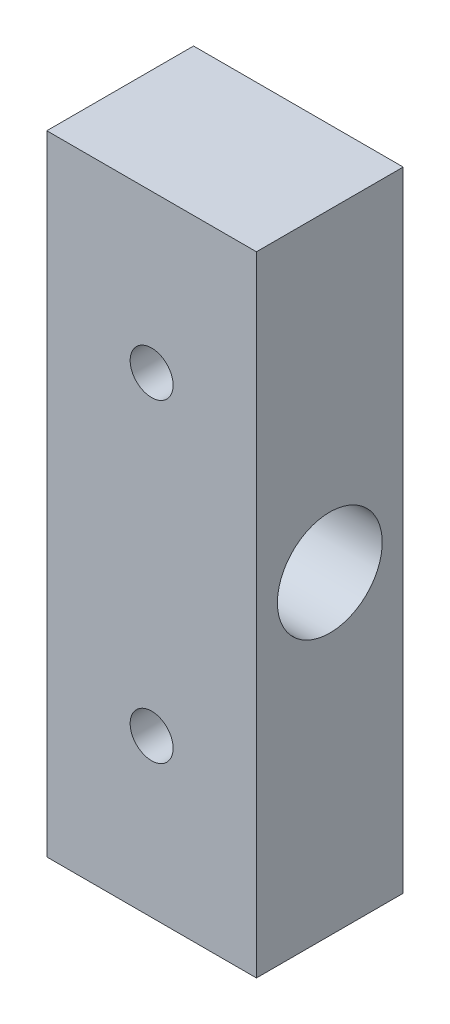
ISO-10303-21;
HEADER;
FILE_DESCRIPTION(('STEP AP214'),'2;1');
FILE_NAME('part.step','',(''),(''),'','','');
FILE_SCHEMA(('AUTOMOTIVE_DESIGN { 1 0 10303 214 1 1 1 1 }'));
ENDSEC;
DATA;
#1=APPLICATION_CONTEXT('core data for automotive mechanical design processes');
#2=APPLICATION_PROTOCOL_DEFINITION('international standard','automotive_design',2000,#1);
#3=PRODUCT_CONTEXT('',#1,'mechanical');
#4=PRODUCT('Part','Part','',(#3));
#5=PRODUCT_RELATED_PRODUCT_CATEGORY('part','',(#4));
#6=PRODUCT_DEFINITION_FORMATION('','',#4);
#7=PRODUCT_DEFINITION_CONTEXT('part definition',#1,'design');
#8=PRODUCT_DEFINITION('design','',#6,#7);
#9=PRODUCT_DEFINITION_SHAPE('','',#8);
#10=(LENGTH_UNIT() NAMED_UNIT(*) SI_UNIT(.MILLI.,.METRE.));
#11=(NAMED_UNIT(*) PLANE_ANGLE_UNIT() SI_UNIT($,.RADIAN.));
#12=(NAMED_UNIT(*) SI_UNIT($,.STERADIAN.) SOLID_ANGLE_UNIT());
#13=UNCERTAINTY_MEASURE_WITH_UNIT(LENGTH_MEASURE(1.E-05),#10,'distance_accuracy_value','');
#14=(GEOMETRIC_REPRESENTATION_CONTEXT(3) GLOBAL_UNCERTAINTY_ASSIGNED_CONTEXT((#13)) GLOBAL_UNIT_ASSIGNED_CONTEXT((#10,
#11,#12)) REPRESENTATION_CONTEXT('',''));
#15=CARTESIAN_POINT('',(0.,0.,0.));
#16=DIRECTION('',(0.,0.,1.));
#17=DIRECTION('',(1.,0.,0.));
#18=AXIS2_PLACEMENT_3D('',#15,#16,#17);
#19=CARTESIAN_POINT('',(10.,60.,-7.));
#20=DIRECTION('',(-1.,0.,0.));
#21=DIRECTION('',(0.,0.,1.));
#22=AXIS2_PLACEMENT_3D('',#19,#20,#21);
#23=PLANE('',#22);
#24=CARTESIAN_POINT('',(10.,30.,0.));
#25=DIRECTION('',(-1.,0.,0.));
#26=DIRECTION('',(0.,0.,1.));
#27=AXIS2_PLACEMENT_3D('',#24,#25,#26);
#28=CIRCLE('',#27,5.);
#29=CARTESIAN_POINT('',(10.,30.,5.));
#30=VERTEX_POINT('',#29);
#31=EDGE_CURVE('E105',#30,#30,#28,.F.);
#32=ORIENTED_EDGE('',*,*,#31,.F.);
#33=EDGE_LOOP('',(#32));
#34=FACE_BOUND('',#33,.T.);
#35=DIRECTION('',(0.,0.,-1.));
#36=VECTOR('',#35,1.);
#37=CARTESIAN_POINT('',(10.,0.,-7.));
#38=LINE('',#37,#36);
#39=CARTESIAN_POINT('',(10.,0.,7.));
#40=VERTEX_POINT('',#39);
#41=CARTESIAN_POINT('',(10.,0.,-7.));
#42=VERTEX_POINT('',#41);
#43=EDGE_CURVE('E102',#40,#42,#38,.T.);
#44=ORIENTED_EDGE('',*,*,#43,.T.);
#45=DIRECTION('',(0.,-1.,0.));
#46=VECTOR('',#45,1.);
#47=CARTESIAN_POINT('',(10.,60.,-7.));
#48=LINE('',#47,#46);
#49=CARTESIAN_POINT('',(10.,60.,-7.));
#50=VERTEX_POINT('',#49);
#51=EDGE_CURVE('E11',#50,#42,#48,.T.);
#52=ORIENTED_EDGE('',*,*,#51,.F.);
#53=DIRECTION('',(0.,0.,-1.));
#54=VECTOR('',#53,1.);
#55=CARTESIAN_POINT('',(10.,60.,-7.));
#56=LINE('',#55,#54);
#57=CARTESIAN_POINT('',(10.,60.,7.));
#58=VERTEX_POINT('',#57);
#59=EDGE_CURVE('E90',#58,#50,#56,.T.);
#60=ORIENTED_EDGE('',*,*,#59,.F.);
#61=DIRECTION('',(0.,-1.,0.));
#62=VECTOR('',#61,1.);
#63=CARTESIAN_POINT('',(10.,60.,7.));
#64=LINE('',#63,#62);
#65=EDGE_CURVE('E98',#58,#40,#64,.T.);
#66=ORIENTED_EDGE('',*,*,#65,.T.);
#67=EDGE_LOOP('',(#44,#52,#60,#66));
#68=FACE_BOUND('',#67,.T.);
#69=ADVANCED_FACE('F39',(#34,#68),#23,.F.);
#70=CARTESIAN_POINT('',(-10.,60.,-7.));
#71=DIRECTION('',(0.,0.,1.));
#72=DIRECTION('',(1.,0.,0.));
#73=AXIS2_PLACEMENT_3D('',#70,#71,#72);
#74=PLANE('',#73);
#75=CARTESIAN_POINT('',(0.,45.,-7.));
#76=DIRECTION('',(0.,0.,-1.));
#77=DIRECTION('',(-1.,0.,0.));
#78=AXIS2_PLACEMENT_3D('',#75,#76,#77);
#79=CIRCLE('',#78,2.05);
#80=CARTESIAN_POINT('',(-2.05,45.,-7.));
#81=VERTEX_POINT('',#80);
#82=EDGE_CURVE('E125',#81,#81,#79,.T.);
#83=ORIENTED_EDGE('',*,*,#82,.F.);
#84=EDGE_LOOP('',(#83));
#85=FACE_BOUND('',#84,.T.);
#86=CARTESIAN_POINT('',(0.,15.,-7.));
#87=DIRECTION('',(0.,0.,-1.));
#88=DIRECTION('',(1.,0.,0.));
#89=AXIS2_PLACEMENT_3D('',#86,#87,#88);
#90=CIRCLE('',#89,2.05);
#91=CARTESIAN_POINT('',(-2.05000000000001,15.,-7.));
#92=VERTEX_POINT('',#91);
#93=EDGE_CURVE('E122',#92,#92,#90,.T.);
#94=ORIENTED_EDGE('',*,*,#93,.F.);
#95=EDGE_LOOP('',(#94));
#96=FACE_BOUND('',#95,.T.);
#97=DIRECTION('',(-1.,0.,0.));
#98=VECTOR('',#97,1.);
#99=CARTESIAN_POINT('',(-10.,0.,-7.));
#100=LINE('',#99,#98);
#101=CARTESIAN_POINT('',(-10.,0.,-7.));
#102=VERTEX_POINT('',#101);
#103=EDGE_CURVE('E94',#42,#102,#100,.T.);
#104=ORIENTED_EDGE('',*,*,#103,.T.);
#105=DIRECTION('',(0.,-1.,0.));
#106=VECTOR('',#105,1.);
#107=CARTESIAN_POINT('',(-10.,60.,-7.));
#108=LINE('',#107,#106);
#109=CARTESIAN_POINT('',(-10.,60.,-7.));
#110=VERTEX_POINT('',#109);
#111=EDGE_CURVE('E47',#110,#102,#108,.T.);
#112=ORIENTED_EDGE('',*,*,#111,.F.);
#113=DIRECTION('',(-1.,0.,0.));
#114=VECTOR('',#113,1.);
#115=CARTESIAN_POINT('',(-10.,60.,-7.));
#116=LINE('',#115,#114);
#117=EDGE_CURVE('E85',#50,#110,#116,.T.);
#118=ORIENTED_EDGE('',*,*,#117,.F.);
#119=ORIENTED_EDGE('',*,*,#51,.T.);
#120=EDGE_LOOP('',(#104,#112,#118,#119));
#121=FACE_BOUND('',#120,.T.);
#122=ADVANCED_FACE('F93',(#85,#96,#121),#74,.F.);
#123=CARTESIAN_POINT('',(-10.,60.,-7.));
#124=DIRECTION('',(1.,0.,0.));
#125=DIRECTION('',(0.,0.,-1.));
#126=AXIS2_PLACEMENT_3D('',#123,#124,#125);
#127=PLANE('',#126);
#128=CARTESIAN_POINT('',(-10.,30.,0.));
#129=DIRECTION('',(-1.,0.,0.));
#130=DIRECTION('',(0.,0.,1.));
#131=AXIS2_PLACEMENT_3D('',#128,#129,#130);
#132=CIRCLE('',#131,5.);
#133=CARTESIAN_POINT('',(-10.,30.,5.));
#134=VERTEX_POINT('',#133);
#135=EDGE_CURVE('E118',#134,#134,#132,.T.);
#136=ORIENTED_EDGE('',*,*,#135,.F.);
#137=EDGE_LOOP('',(#136));
#138=FACE_BOUND('',#137,.T.);
#139=DIRECTION('',(0.,0.,1.));
#140=VECTOR('',#139,1.);
#141=CARTESIAN_POINT('',(-10.,0.,-7.));
#142=LINE('',#141,#140);
#143=CARTESIAN_POINT('',(-10.,0.,7.));
#144=VERTEX_POINT('',#143);
#145=EDGE_CURVE('E72',#102,#144,#142,.T.);
#146=ORIENTED_EDGE('',*,*,#145,.T.);
#147=DIRECTION('',(0.,-1.,0.));
#148=VECTOR('',#147,1.);
#149=CARTESIAN_POINT('',(-10.,60.,7.));
#150=LINE('',#149,#148);
#151=CARTESIAN_POINT('',(-10.,60.,7.));
#152=VERTEX_POINT('',#151);
#153=EDGE_CURVE('E95',#152,#144,#150,.T.);
#154=ORIENTED_EDGE('',*,*,#153,.F.);
#155=DIRECTION('',(0.,0.,1.));
#156=VECTOR('',#155,1.);
#157=CARTESIAN_POINT('',(-10.,60.,-7.));
#158=LINE('',#157,#156);
#159=EDGE_CURVE('E88',#110,#152,#158,.T.);
#160=ORIENTED_EDGE('',*,*,#159,.F.);
#161=ORIENTED_EDGE('',*,*,#111,.T.);
#162=EDGE_LOOP('',(#146,#154,#160,#161));
#163=FACE_BOUND('',#162,.T.);
#164=ADVANCED_FACE('F96',(#138,#163),#127,.F.);
#165=CARTESIAN_POINT('',(-10.,60.,7.));
#166=DIRECTION('',(0.,0.,-1.));
#167=DIRECTION('',(-1.,0.,0.));
#168=AXIS2_PLACEMENT_3D('',#165,#166,#167);
#169=PLANE('',#168);
#170=CARTESIAN_POINT('',(0.,45.,7.));
#171=DIRECTION('',(0.,0.,-1.));
#172=DIRECTION('',(-1.,0.,0.));
#173=AXIS2_PLACEMENT_3D('',#170,#171,#172);
#174=CIRCLE('',#173,2.05);
#175=CARTESIAN_POINT('',(-2.05,45.,7.));
#176=VERTEX_POINT('',#175);
#177=EDGE_CURVE('E121',#176,#176,#174,.F.);
#178=ORIENTED_EDGE('',*,*,#177,.F.);
#179=EDGE_LOOP('',(#178));
#180=FACE_BOUND('',#179,.T.);
#181=CARTESIAN_POINT('',(0.,15.,7.));
#182=DIRECTION('',(0.,0.,-1.));
#183=DIRECTION('',(-1.,0.,0.));
#184=AXIS2_PLACEMENT_3D('',#181,#182,#183);
#185=CIRCLE('',#184,2.05);
#186=CARTESIAN_POINT('',(-2.05000000000001,15.,7.));
#187=VERTEX_POINT('',#186);
#188=EDGE_CURVE('E126',#187,#187,#185,.F.);
#189=ORIENTED_EDGE('',*,*,#188,.F.);
#190=EDGE_LOOP('',(#189));
#191=FACE_BOUND('',#190,.T.);
#192=DIRECTION('',(1.,0.,0.));
#193=VECTOR('',#192,1.);
#194=CARTESIAN_POINT('',(-10.,0.,7.));
#195=LINE('',#194,#193);
#196=EDGE_CURVE('E78',#144,#40,#195,.T.);
#197=ORIENTED_EDGE('',*,*,#196,.T.);
#198=ORIENTED_EDGE('',*,*,#65,.F.);
#199=DIRECTION('',(1.,0.,0.));
#200=VECTOR('',#199,1.);
#201=CARTESIAN_POINT('',(-10.,60.,7.));
#202=LINE('',#201,#200);
#203=EDGE_CURVE('E55',#152,#58,#202,.T.);
#204=ORIENTED_EDGE('',*,*,#203,.F.);
#205=ORIENTED_EDGE('',*,*,#153,.T.);
#206=EDGE_LOOP('',(#197,#198,#204,#205));
#207=FACE_BOUND('',#206,.T.);
#208=ADVANCED_FACE('F110',(#180,#191,#207),#169,.F.);
#209=CARTESIAN_POINT('',(0.,60.,0.));
#210=DIRECTION('',(0.,1.,0.));
#211=DIRECTION('',(0.,0.,1.));
#212=AXIS2_PLACEMENT_3D('',#209,#210,#211);
#213=PLANE('',#212);
#214=ORIENTED_EDGE('',*,*,#59,.T.);
#215=ORIENTED_EDGE('',*,*,#117,.T.);
#216=ORIENTED_EDGE('',*,*,#159,.T.);
#217=ORIENTED_EDGE('',*,*,#203,.T.);
#218=EDGE_LOOP('',(#214,#215,#216,#217));
#219=FACE_BOUND('',#218,.T.);
#220=ADVANCED_FACE('F86',(#219),#213,.T.);
#221=CARTESIAN_POINT('',(0.,0.,0.));
#222=DIRECTION('',(0.,1.,0.));
#223=DIRECTION('',(0.,0.,1.));
#224=AXIS2_PLACEMENT_3D('',#221,#222,#223);
#225=PLANE('',#224);
#226=ORIENTED_EDGE('',*,*,#43,.F.);
#227=ORIENTED_EDGE('',*,*,#196,.F.);
#228=ORIENTED_EDGE('',*,*,#145,.F.);
#229=ORIENTED_EDGE('',*,*,#103,.F.);
#230=EDGE_LOOP('',(#226,#227,#228,#229));
#231=FACE_BOUND('',#230,.T.);
#232=ADVANCED_FACE('F113',(#231),#225,.F.);
#233=CARTESIAN_POINT('',(10.001,30.,0.));
#234=DIRECTION('',(-1.,0.,0.));
#235=DIRECTION('',(0.,0.,1.));
#236=AXIS2_PLACEMENT_3D('',#233,#234,#235);
#237=CYLINDRICAL_SURFACE('',#236,5.);
#238=ORIENTED_EDGE('',*,*,#135,.T.);
#239=EDGE_LOOP('',(#238));
#240=FACE_BOUND('',#239,.T.);
#241=ORIENTED_EDGE('',*,*,#31,.T.);
#242=EDGE_LOOP('',(#241));
#243=FACE_BOUND('',#242,.T.);
#244=ADVANCED_FACE('F144',(#240,#243),#237,.F.);
#245=CARTESIAN_POINT('',(0.,15.,7.001));
#246=DIRECTION('',(0.,0.,-1.));
#247=DIRECTION('',(-1.,0.,0.));
#248=AXIS2_PLACEMENT_3D('',#245,#246,#247);
#249=CYLINDRICAL_SURFACE('',#248,2.05);
#250=CARTESIAN_POINT('',(-2.05000000000001,15.,-7.));
#251=CARTESIAN_POINT('',(-2.05000000000001,15.,-6.85416666666667));
#252=CARTESIAN_POINT('',(-2.05000000000001,15.,-6.70833333333333));
#253=CARTESIAN_POINT('',(-2.05000000000001,15.,-6.41666666666667));
#254=CARTESIAN_POINT('',(-2.05000000000001,15.,-6.27083333333333));
#255=CARTESIAN_POINT('',(-2.05000000000001,15.,-5.97916666666667));
#256=CARTESIAN_POINT('',(-2.05000000000001,15.,-5.83333333333333));
#257=CARTESIAN_POINT('',(-2.05000000000001,15.,-5.54166666666667));
#258=CARTESIAN_POINT('',(-2.05000000000001,15.,-5.39583333333333));
#259=CARTESIAN_POINT('',(-2.05000000000001,15.,-5.10416666666667));
#260=CARTESIAN_POINT('',(-2.05000000000001,15.,-4.95833333333333));
#261=CARTESIAN_POINT('',(-2.05000000000001,15.,-4.66666666666667));
#262=CARTESIAN_POINT('',(-2.05000000000001,15.,-4.52083333333333));
#263=CARTESIAN_POINT('',(-2.05000000000001,15.,-4.22916666666667));
#264=CARTESIAN_POINT('',(-2.05000000000001,15.,-4.08333333333333));
#265=CARTESIAN_POINT('',(-2.05000000000001,15.,-3.79166666666667));
#266=CARTESIAN_POINT('',(-2.05000000000001,15.,-3.64583333333333));
#267=CARTESIAN_POINT('',(-2.05000000000001,15.,-3.35416666666667));
#268=CARTESIAN_POINT('',(-2.05000000000001,15.,-3.20833333333333));
#269=CARTESIAN_POINT('',(-2.05000000000001,15.,-2.91666666666667));
#270=CARTESIAN_POINT('',(-2.05000000000001,15.,-2.77083333333333));
#271=CARTESIAN_POINT('',(-2.05000000000001,15.,-2.47916666666667));
#272=CARTESIAN_POINT('',(-2.05000000000001,15.,-2.33333333333333));
#273=CARTESIAN_POINT('',(-2.05000000000001,15.,-2.04166666666667));
#274=CARTESIAN_POINT('',(-2.05000000000001,15.,-1.89583333333333));
#275=CARTESIAN_POINT('',(-2.05000000000001,15.,-1.60416666666667));
#276=CARTESIAN_POINT('',(-2.05000000000001,15.,-1.45833333333333));
#277=CARTESIAN_POINT('',(-2.05000000000001,15.,-1.16666666666667));
#278=CARTESIAN_POINT('',(-2.05000000000001,15.,-1.02083333333333));
#279=CARTESIAN_POINT('',(-2.05000000000001,15.,-0.729166666666666));
#280=CARTESIAN_POINT('',(-2.05000000000001,15.,-0.583333333333333));
#281=CARTESIAN_POINT('',(-2.05000000000001,15.,-0.291666666666667));
#282=CARTESIAN_POINT('',(-2.05000000000001,15.,-0.145833333333333));
#283=CARTESIAN_POINT('',(-2.05000000000001,15.,0.145833333333333));
#284=CARTESIAN_POINT('',(-2.05000000000001,15.,0.291666666666667));
#285=CARTESIAN_POINT('',(-2.05000000000001,15.,0.583333333333333));
#286=CARTESIAN_POINT('',(-2.05000000000001,15.,0.729166666666667));
#287=CARTESIAN_POINT('',(-2.05000000000001,15.,1.02083333333333));
#288=CARTESIAN_POINT('',(-2.05000000000001,15.,1.16666666666667));
#289=CARTESIAN_POINT('',(-2.05000000000001,15.,1.45833333333333));
#290=CARTESIAN_POINT('',(-2.05000000000001,15.,1.60416666666667));
#291=CARTESIAN_POINT('',(-2.05000000000001,15.,1.89583333333333));
#292=CARTESIAN_POINT('',(-2.05000000000001,15.,2.04166666666667));
#293=CARTESIAN_POINT('',(-2.05000000000001,15.,2.33333333333333));
#294=CARTESIAN_POINT('',(-2.05000000000001,15.,2.47916666666667));
#295=CARTESIAN_POINT('',(-2.05000000000001,15.,2.77083333333333));
#296=CARTESIAN_POINT('',(-2.05000000000001,15.,2.91666666666667));
#297=CARTESIAN_POINT('',(-2.05000000000001,15.,3.20833333333333));
#298=CARTESIAN_POINT('',(-2.05000000000001,15.,3.35416666666667));
#299=CARTESIAN_POINT('',(-2.05000000000001,15.,3.64583333333333));
#300=CARTESIAN_POINT('',(-2.05000000000001,15.,3.79166666666667));
#301=CARTESIAN_POINT('',(-2.05000000000001,15.,4.08333333333333));
#302=CARTESIAN_POINT('',(-2.05000000000001,15.,4.22916666666667));
#303=CARTESIAN_POINT('',(-2.05000000000001,15.,4.52083333333333));
#304=CARTESIAN_POINT('',(-2.05000000000001,15.,4.66666666666667));
#305=CARTESIAN_POINT('',(-2.05000000000001,15.,4.95833333333333));
#306=CARTESIAN_POINT('',(-2.05000000000001,15.,5.10416666666667));
#307=CARTESIAN_POINT('',(-2.05000000000001,15.,5.39583333333333));
#308=CARTESIAN_POINT('',(-2.05000000000001,15.,5.54166666666667));
#309=CARTESIAN_POINT('',(-2.05000000000001,15.,5.83333333333333));
#310=CARTESIAN_POINT('',(-2.05000000000001,15.,5.97916666666667));
#311=CARTESIAN_POINT('',(-2.05000000000001,15.,6.27083333333333));
#312=CARTESIAN_POINT('',(-2.05000000000001,15.,6.41666666666667));
#313=CARTESIAN_POINT('',(-2.05000000000001,15.,6.70833333333333));
#314=CARTESIAN_POINT('',(-2.05000000000001,15.,6.85416666666667));
#315=CARTESIAN_POINT('',(-2.05000000000001,15.,7.));
#316=B_SPLINE_CURVE_WITH_KNOTS('',3,(#250,#251,#252,#253,#254,#255,#256,#257,#258,#259,#260,
#261,#262,#263,#264,#265,#266,#267,#268,#269,#270,#271,#272,#273,#274,#275,#276,#277,#278,#279,
#280,#281,#282,#283,#284,#285,#286,#287,#288,#289,#290,#291,#292,#293,#294,#295,#296,#297,#298,
#299,#300,#301,#302,#303,#304,#305,#306,#307,#308,#309,#310,#311,#312,#313,#314,#315),
.UNSPECIFIED.,.F.,.F.,(4,2,2,2,2,2,2,2,2,2,2,2,2,2,2,2,2,2,2,2,2,2,2,2,2,2,2,2,2,2,2,2,4),(0.,
0.4375,0.875000000000001,1.3125,1.75,2.1875,2.625,3.0625,3.5,3.9375,4.375,4.8125,5.25,5.6875,
6.125,6.5625,7.,7.4375,7.875,8.3125,8.75,9.1875,9.625,10.0625,10.5,10.9375,11.375,11.8125,12.25,
12.6875,13.125,13.5625,14.),.UNSPECIFIED.);
#317=EDGE_CURVE('BSEAM141',#92,#187,#316,.T.);
#318=ORIENTED_EDGE('',*,*,#93,.T.);
#319=ORIENTED_EDGE('',*,*,#188,.T.);
#320=ORIENTED_EDGE('',*,*,#317,.T.);
#321=ORIENTED_EDGE('',*,*,#317,.F.);
#322=EDGE_LOOP('',(#318,#320,#319,#321));
#323=FACE_BOUND('',#322,.T.);
#324=ADVANCED_FACE('F141',(#323),#249,.F.);
#325=CARTESIAN_POINT('',(0.,45.,7.001));
#326=DIRECTION('',(0.,0.,-1.));
#327=DIRECTION('',(-1.,0.,0.));
#328=AXIS2_PLACEMENT_3D('',#325,#326,#327);
#329=CYLINDRICAL_SURFACE('',#328,2.05);
#330=CARTESIAN_POINT('',(-2.05,45.,-7.));
#331=CARTESIAN_POINT('',(-2.05,45.,-6.85416666666667));
#332=CARTESIAN_POINT('',(-2.05,45.,-6.70833333333333));
#333=CARTESIAN_POINT('',(-2.05,45.,-6.41666666666667));
#334=CARTESIAN_POINT('',(-2.05,45.,-6.27083333333333));
#335=CARTESIAN_POINT('',(-2.05,45.,-5.97916666666667));
#336=CARTESIAN_POINT('',(-2.05,45.,-5.83333333333333));
#337=CARTESIAN_POINT('',(-2.05,45.,-5.54166666666667));
#338=CARTESIAN_POINT('',(-2.05,45.,-5.39583333333333));
#339=CARTESIAN_POINT('',(-2.05,45.,-5.10416666666667));
#340=CARTESIAN_POINT('',(-2.05,45.,-4.95833333333333));
#341=CARTESIAN_POINT('',(-2.05,45.,-4.66666666666667));
#342=CARTESIAN_POINT('',(-2.05,45.,-4.52083333333333));
#343=CARTESIAN_POINT('',(-2.05,45.,-4.22916666666667));
#344=CARTESIAN_POINT('',(-2.05,45.,-4.08333333333333));
#345=CARTESIAN_POINT('',(-2.05,45.,-3.79166666666667));
#346=CARTESIAN_POINT('',(-2.05,45.,-3.64583333333333));
#347=CARTESIAN_POINT('',(-2.05,45.,-3.35416666666667));
#348=CARTESIAN_POINT('',(-2.05,45.,-3.20833333333333));
#349=CARTESIAN_POINT('',(-2.05,45.,-2.91666666666667));
#350=CARTESIAN_POINT('',(-2.05,45.,-2.77083333333333));
#351=CARTESIAN_POINT('',(-2.05,45.,-2.47916666666667));
#352=CARTESIAN_POINT('',(-2.05,45.,-2.33333333333333));
#353=CARTESIAN_POINT('',(-2.05,45.,-2.04166666666667));
#354=CARTESIAN_POINT('',(-2.05,45.,-1.89583333333333));
#355=CARTESIAN_POINT('',(-2.05,45.,-1.60416666666667));
#356=CARTESIAN_POINT('',(-2.05,45.,-1.45833333333333));
#357=CARTESIAN_POINT('',(-2.05,45.,-1.16666666666667));
#358=CARTESIAN_POINT('',(-2.05,45.,-1.02083333333333));
#359=CARTESIAN_POINT('',(-2.05,45.,-0.729166666666666));
#360=CARTESIAN_POINT('',(-2.05,45.,-0.583333333333333));
#361=CARTESIAN_POINT('',(-2.05,45.,-0.291666666666667));
#362=CARTESIAN_POINT('',(-2.05,45.,-0.145833333333333));
#363=CARTESIAN_POINT('',(-2.05,45.,0.145833333333333));
#364=CARTESIAN_POINT('',(-2.05,45.,0.291666666666667));
#365=CARTESIAN_POINT('',(-2.05,45.,0.583333333333333));
#366=CARTESIAN_POINT('',(-2.05,45.,0.729166666666667));
#367=CARTESIAN_POINT('',(-2.05,45.,1.02083333333333));
#368=CARTESIAN_POINT('',(-2.05,45.,1.16666666666667));
#369=CARTESIAN_POINT('',(-2.05,45.,1.45833333333333));
#370=CARTESIAN_POINT('',(-2.05,45.,1.60416666666667));
#371=CARTESIAN_POINT('',(-2.05,45.,1.89583333333333));
#372=CARTESIAN_POINT('',(-2.05,45.,2.04166666666667));
#373=CARTESIAN_POINT('',(-2.05,45.,2.33333333333333));
#374=CARTESIAN_POINT('',(-2.05,45.,2.47916666666667));
#375=CARTESIAN_POINT('',(-2.05,45.,2.77083333333333));
#376=CARTESIAN_POINT('',(-2.05,45.,2.91666666666667));
#377=CARTESIAN_POINT('',(-2.05,45.,3.20833333333333));
#378=CARTESIAN_POINT('',(-2.05,45.,3.35416666666667));
#379=CARTESIAN_POINT('',(-2.05,45.,3.64583333333333));
#380=CARTESIAN_POINT('',(-2.05,45.,3.79166666666667));
#381=CARTESIAN_POINT('',(-2.05,45.,4.08333333333333));
#382=CARTESIAN_POINT('',(-2.05,45.,4.22916666666667));
#383=CARTESIAN_POINT('',(-2.05,45.,4.52083333333333));
#384=CARTESIAN_POINT('',(-2.05,45.,4.66666666666667));
#385=CARTESIAN_POINT('',(-2.05,45.,4.95833333333333));
#386=CARTESIAN_POINT('',(-2.05,45.,5.10416666666667));
#387=CARTESIAN_POINT('',(-2.05,45.,5.39583333333333));
#388=CARTESIAN_POINT('',(-2.05,45.,5.54166666666667));
#389=CARTESIAN_POINT('',(-2.05,45.,5.83333333333333));
#390=CARTESIAN_POINT('',(-2.05,45.,5.97916666666667));
#391=CARTESIAN_POINT('',(-2.05,45.,6.27083333333333));
#392=CARTESIAN_POINT('',(-2.05,45.,6.41666666666667));
#393=CARTESIAN_POINT('',(-2.05,45.,6.70833333333333));
#394=CARTESIAN_POINT('',(-2.05,45.,6.85416666666667));
#395=CARTESIAN_POINT('',(-2.05,45.,7.));
#396=B_SPLINE_CURVE_WITH_KNOTS('',3,(#330,#331,#332,#333,#334,#335,#336,#337,#338,#339,#340,
#341,#342,#343,#344,#345,#346,#347,#348,#349,#350,#351,#352,#353,#354,#355,#356,#357,#358,#359,
#360,#361,#362,#363,#364,#365,#366,#367,#368,#369,#370,#371,#372,#373,#374,#375,#376,#377,#378,
#379,#380,#381,#382,#383,#384,#385,#386,#387,#388,#389,#390,#391,#392,#393,#394,#395),
.UNSPECIFIED.,.F.,.F.,(4,2,2,2,2,2,2,2,2,2,2,2,2,2,2,2,2,2,2,2,2,2,2,2,2,2,2,2,2,2,2,2,4),(0.,
0.4375,0.875000000000001,1.3125,1.75,2.1875,2.625,3.0625,3.5,3.9375,4.375,4.8125,5.25,5.6875,
6.125,6.5625,7.,7.4375,7.875,8.3125,8.75,9.1875,9.625,10.0625,10.5,10.9375,11.375,11.8125,12.25,
12.6875,13.125,13.5625,14.),.UNSPECIFIED.);
#397=EDGE_CURVE('BSEAM134',#81,#176,#396,.T.);
#398=ORIENTED_EDGE('',*,*,#82,.T.);
#399=ORIENTED_EDGE('',*,*,#177,.T.);
#400=ORIENTED_EDGE('',*,*,#397,.T.);
#401=ORIENTED_EDGE('',*,*,#397,.F.);
#402=EDGE_LOOP('',(#398,#400,#399,#401));
#403=FACE_BOUND('',#402,.T.);
#404=ADVANCED_FACE('F134',(#403),#329,.F.);
#405=CLOSED_SHELL('',(#69,#122,#164,#208,#220,#232,#244,#324,#404));
#406=MANIFOLD_SOLID_BREP('B2',#405);
#407=ADVANCED_BREP_SHAPE_REPRESENTATION('',(#18,#406),#14);
#408=SHAPE_DEFINITION_REPRESENTATION(#9,#407);
ENDSEC;
END-ISO-10303-21;
